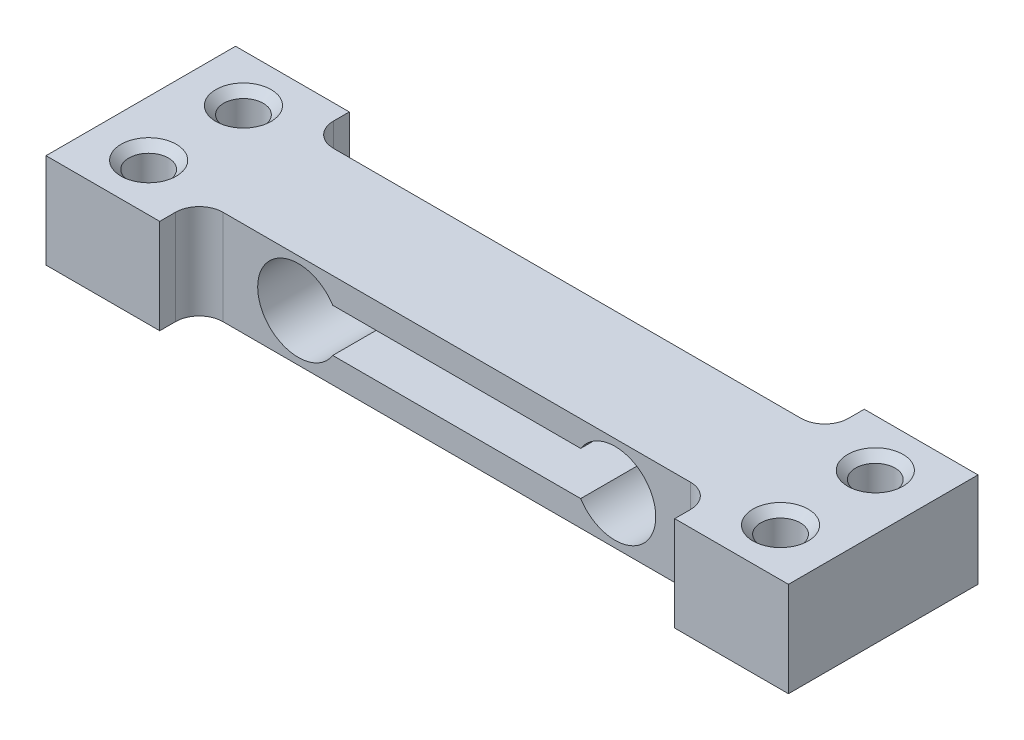
ISO-10303-21;
HEADER;
FILE_DESCRIPTION(('STEP AP214'),'2;1');
FILE_NAME('part.step','',(''),(''),'','','');
FILE_SCHEMA(('AUTOMOTIVE_DESIGN { 1 0 10303 214 1 1 1 1 }'));
ENDSEC;
DATA;
#1=APPLICATION_CONTEXT('core data for automotive mechanical design processes');
#2=APPLICATION_PROTOCOL_DEFINITION('international standard','automotive_design',2000,#1);
#3=PRODUCT_CONTEXT('',#1,'mechanical');
#4=PRODUCT('Part','Part','',(#3));
#5=PRODUCT_RELATED_PRODUCT_CATEGORY('part','',(#4));
#6=PRODUCT_DEFINITION_FORMATION('','',#4);
#7=PRODUCT_DEFINITION_CONTEXT('part definition',#1,'design');
#8=PRODUCT_DEFINITION('design','',#6,#7);
#9=PRODUCT_DEFINITION_SHAPE('','',#8);
#10=(LENGTH_UNIT() NAMED_UNIT(*) SI_UNIT(.MILLI.,.METRE.));
#11=(NAMED_UNIT(*) PLANE_ANGLE_UNIT() SI_UNIT($,.RADIAN.));
#12=(NAMED_UNIT(*) SI_UNIT($,.STERADIAN.) SOLID_ANGLE_UNIT());
#13=UNCERTAINTY_MEASURE_WITH_UNIT(LENGTH_MEASURE(1.E-05),#10,'distance_accuracy_value','');
#14=(GEOMETRIC_REPRESENTATION_CONTEXT(3) GLOBAL_UNCERTAINTY_ASSIGNED_CONTEXT((#13)) GLOBAL_UNIT_ASSIGNED_CONTEXT((#10,
#11,#12)) REPRESENTATION_CONTEXT('',''));
#15=CARTESIAN_POINT('',(0.,0.,0.));
#16=DIRECTION('',(0.,0.,1.));
#17=DIRECTION('',(1.,0.,0.));
#18=AXIS2_PLACEMENT_3D('',#15,#16,#17);
#19=CARTESIAN_POINT('',(0.,3.,-3.5));
#20=DIRECTION('',(0.,0.,1.));
#21=DIRECTION('',(1.,0.,0.));
#22=AXIS2_PLACEMENT_3D('',#19,#20,#21);
#23=PLANE('',#22);
#24=DIRECTION('',(1.,0.,0.));
#25=VECTOR('',#24,1.);
#26=CARTESIAN_POINT('',(0.,1.375,-3.5));
#27=LINE('',#26,#25);
#28=CARTESIAN_POINT('',(-7.84784589429227,1.375,-3.5));
#29=VERTEX_POINT('',#28);
#30=CARTESIAN_POINT('',(7.84784589429227,1.375,-3.5));
#31=VERTEX_POINT('',#30);
#32=EDGE_CURVE('E208',#29,#31,#27,.T.);
#33=ORIENTED_EDGE('',*,*,#32,.F.);
#34=CARTESIAN_POINT('',(-10.025,0.,-3.5));
#35=DIRECTION('',(0.,0.,-1.));
#36=DIRECTION('',(-1.,0.,0.));
#37=AXIS2_PLACEMENT_3D('',#34,#35,#36);
#38=CIRCLE('',#37,2.575);
#39=CARTESIAN_POINT('',(-7.84784589429227,-1.375,-3.5));
#40=VERTEX_POINT('',#39);
#41=EDGE_CURVE('E293',#40,#29,#38,.T.);
#42=ORIENTED_EDGE('',*,*,#41,.F.);
#43=DIRECTION('',(1.,0.,0.));
#44=VECTOR('',#43,1.);
#45=CARTESIAN_POINT('',(0.,-1.375,-3.5));
#46=LINE('',#45,#44);
#47=CARTESIAN_POINT('',(7.84784589429227,-1.375,-3.5));
#48=VERTEX_POINT('',#47);
#49=EDGE_CURVE('E205',#40,#48,#46,.T.);
#50=ORIENTED_EDGE('',*,*,#49,.T.);
#51=CARTESIAN_POINT('',(10.025,0.,-3.5));
#52=DIRECTION('',(0.,0.,1.));
#53=DIRECTION('',(1.,0.,0.));
#54=AXIS2_PLACEMENT_3D('',#51,#52,#53);
#55=CIRCLE('',#54,2.575);
#56=EDGE_CURVE('E148',#48,#31,#55,.T.);
#57=ORIENTED_EDGE('',*,*,#56,.T.);
#58=EDGE_LOOP('',(#33,#42,#50,#57));
#59=FACE_BOUND('',#58,.T.);
#60=DIRECTION('',(-1.,0.,0.));
#61=VECTOR('',#60,1.);
#62=CARTESIAN_POINT('',(0.,-3.,-3.5));
#63=LINE('',#62,#61);
#64=CARTESIAN_POINT('',(14.8,-3.,-3.5));
#65=VERTEX_POINT('',#64);
#66=CARTESIAN_POINT('',(-14.8,-3.,-3.5));
#67=VERTEX_POINT('',#66);
#68=EDGE_CURVE('E144',#65,#67,#63,.T.);
#69=ORIENTED_EDGE('',*,*,#68,.T.);
#70=DIRECTION('',(0.,-1.,0.));
#71=VECTOR('',#70,1.);
#72=CARTESIAN_POINT('',(-14.8,3.,-3.5));
#73=LINE('',#72,#71);
#74=CARTESIAN_POINT('',(-14.8,3.,-3.5));
#75=VERTEX_POINT('',#74);
#76=EDGE_CURVE('E267',#75,#67,#73,.T.);
#77=ORIENTED_EDGE('',*,*,#76,.F.);
#78=DIRECTION('',(-1.,0.,0.));
#79=VECTOR('',#78,1.);
#80=CARTESIAN_POINT('',(0.,3.,-3.5));
#81=LINE('',#80,#79);
#82=CARTESIAN_POINT('',(14.8,3.,-3.5));
#83=VERTEX_POINT('',#82);
#84=EDGE_CURVE('E162',#83,#75,#81,.T.);
#85=ORIENTED_EDGE('',*,*,#84,.F.);
#86=DIRECTION('',(0.,-1.,0.));
#87=VECTOR('',#86,1.);
#88=CARTESIAN_POINT('',(14.8,3.,-3.5));
#89=LINE('',#88,#87);
#90=EDGE_CURVE('E140',#83,#65,#89,.T.);
#91=ORIENTED_EDGE('',*,*,#90,.T.);
#92=EDGE_LOOP('',(#69,#77,#85,#91));
#93=FACE_BOUND('',#92,.T.);
#94=ADVANCED_FACE('F35',(#59,#93),#23,.F.);
#95=CARTESIAN_POINT('',(14.8,3.,3.5));
#96=DIRECTION('',(0.,0.,-1.));
#97=DIRECTION('',(-1.,0.,0.));
#98=AXIS2_PLACEMENT_3D('',#95,#96,#97);
#99=PLANE('',#98);
#100=CARTESIAN_POINT('',(-10.025,0.,3.5));
#101=DIRECTION('',(0.,0.,-1.));
#102=DIRECTION('',(-1.,0.,0.));
#103=AXIS2_PLACEMENT_3D('',#100,#101,#102);
#104=CIRCLE('',#103,2.575);
#105=CARTESIAN_POINT('',(-7.84784589429227,-1.375,3.5));
#106=VERTEX_POINT('',#105);
#107=CARTESIAN_POINT('',(-7.84784589429227,1.375,3.5));
#108=VERTEX_POINT('',#107);
#109=EDGE_CURVE('E319',#106,#108,#104,.T.);
#110=ORIENTED_EDGE('',*,*,#109,.T.);
#111=DIRECTION('',(1.,0.,0.));
#112=VECTOR('',#111,1.);
#113=CARTESIAN_POINT('',(0.,1.375,3.5));
#114=LINE('',#113,#112);
#115=CARTESIAN_POINT('',(7.84784589429227,1.375,3.5));
#116=VERTEX_POINT('',#115);
#117=EDGE_CURVE('E218',#108,#116,#114,.T.);
#118=ORIENTED_EDGE('',*,*,#117,.T.);
#119=CARTESIAN_POINT('',(10.025,0.,3.5));
#120=DIRECTION('',(0.,0.,1.));
#121=DIRECTION('',(1.,0.,0.));
#122=AXIS2_PLACEMENT_3D('',#119,#120,#121);
#123=CIRCLE('',#122,2.575);
#124=CARTESIAN_POINT('',(7.84784589429227,-1.375,3.5));
#125=VERTEX_POINT('',#124);
#126=EDGE_CURVE('E49',#125,#116,#123,.T.);
#127=ORIENTED_EDGE('',*,*,#126,.F.);
#128=DIRECTION('',(1.,0.,0.));
#129=VECTOR('',#128,1.);
#130=CARTESIAN_POINT('',(0.,-1.375,3.5));
#131=LINE('',#130,#129);
#132=EDGE_CURVE('E214',#106,#125,#131,.T.);
#133=ORIENTED_EDGE('',*,*,#132,.F.);
#134=EDGE_LOOP('',(#110,#118,#127,#133));
#135=FACE_BOUND('',#134,.T.);
#136=DIRECTION('',(1.,0.,0.));
#137=VECTOR('',#136,1.);
#138=CARTESIAN_POINT('',(14.8,3.,3.5));
#139=LINE('',#138,#137);
#140=CARTESIAN_POINT('',(-14.8,3.,3.5));
#141=VERTEX_POINT('',#140);
#142=CARTESIAN_POINT('',(14.8,3.,3.5));
#143=VERTEX_POINT('',#142);
#144=EDGE_CURVE('E99',#141,#143,#139,.T.);
#145=ORIENTED_EDGE('',*,*,#144,.F.);
#146=DIRECTION('',(0.,-1.,0.));
#147=VECTOR('',#146,1.);
#148=CARTESIAN_POINT('',(-14.8,3.,3.5));
#149=LINE('',#148,#147);
#150=CARTESIAN_POINT('',(-14.8,-3.,3.5));
#151=VERTEX_POINT('',#150);
#152=EDGE_CURVE('E246',#141,#151,#149,.T.);
#153=ORIENTED_EDGE('',*,*,#152,.T.);
#154=DIRECTION('',(1.,0.,0.));
#155=VECTOR('',#154,1.);
#156=CARTESIAN_POINT('',(14.8,-3.,3.5));
#157=LINE('',#156,#155);
#158=CARTESIAN_POINT('',(14.8,-3.,3.5));
#159=VERTEX_POINT('',#158);
#160=EDGE_CURVE('E147',#151,#159,#157,.T.);
#161=ORIENTED_EDGE('',*,*,#160,.T.);
#162=DIRECTION('',(0.,-1.,0.));
#163=VECTOR('',#162,1.);
#164=CARTESIAN_POINT('',(14.8,3.,3.5));
#165=LINE('',#164,#163);
#166=EDGE_CURVE('E11',#143,#159,#165,.T.);
#167=ORIENTED_EDGE('',*,*,#166,.F.);
#168=EDGE_LOOP('',(#145,#153,#161,#167));
#169=FACE_BOUND('',#168,.T.);
#170=ADVANCED_FACE('F389',(#135,#169),#99,.F.);
#171=CARTESIAN_POINT('',(14.8,3.,4.99999999999999));
#172=DIRECTION('',(0.,-1.,0.));
#173=DIRECTION('',(0.,0.,-1.));
#174=AXIS2_PLACEMENT_3D('',#171,#172,#173);
#175=CYLINDRICAL_SURFACE('',#174,1.5);
#176=CARTESIAN_POINT('',(14.8,-3.,4.99999999999999));
#177=DIRECTION('',(0.,-1.,0.));
#178=DIRECTION('',(0.,0.,1.));
#179=AXIS2_PLACEMENT_3D('',#176,#177,#178);
#180=CIRCLE('',#179,1.5);
#181=CARTESIAN_POINT('',(16.3,-3.,4.99999999999999));
#182=VERTEX_POINT('',#181);
#183=EDGE_CURVE('E150',#159,#182,#180,.T.);
#184=ORIENTED_EDGE('',*,*,#183,.T.);
#185=DIRECTION('',(0.,-1.,0.));
#186=VECTOR('',#185,1.);
#187=CARTESIAN_POINT('',(16.3,3.,4.99999999999999));
#188=LINE('',#187,#186);
#189=CARTESIAN_POINT('',(16.3,3.,4.99999999999999));
#190=VERTEX_POINT('',#189);
#191=EDGE_CURVE('E42',#190,#182,#188,.T.);
#192=ORIENTED_EDGE('',*,*,#191,.F.);
#193=CARTESIAN_POINT('',(14.8,3.,4.99999999999999));
#194=DIRECTION('',(0.,-1.,0.));
#195=DIRECTION('',(0.,0.,1.));
#196=AXIS2_PLACEMENT_3D('',#193,#194,#195);
#197=CIRCLE('',#196,1.5);
#198=EDGE_CURVE('E199',#143,#190,#197,.T.);
#199=ORIENTED_EDGE('',*,*,#198,.F.);
#200=ORIENTED_EDGE('',*,*,#166,.T.);
#201=EDGE_LOOP('',(#184,#192,#199,#200));
#202=FACE_BOUND('',#201,.T.);
#203=ADVANCED_FACE('F394',(#202),#175,.F.);
#204=CARTESIAN_POINT('',(16.3,3.,4.99999999999999));
#205=DIRECTION('',(1.,0.,0.));
#206=DIRECTION('',(0.,0.,-1.));
#207=AXIS2_PLACEMENT_3D('',#204,#205,#206);
#208=PLANE('',#207);
#209=DIRECTION('',(0.,0.,1.));
#210=VECTOR('',#209,1.);
#211=CARTESIAN_POINT('',(16.3,-3.,4.99999999999999));
#212=LINE('',#211,#210);
#213=CARTESIAN_POINT('',(16.3,-3.,6.));
#214=VERTEX_POINT('',#213);
#215=EDGE_CURVE('E152',#182,#214,#212,.T.);
#216=ORIENTED_EDGE('',*,*,#215,.T.);
#217=DIRECTION('',(0.,-1.,0.));
#218=VECTOR('',#217,1.);
#219=CARTESIAN_POINT('',(16.3,3.,6.));
#220=LINE('',#219,#218);
#221=CARTESIAN_POINT('',(16.3,3.,6.));
#222=VERTEX_POINT('',#221);
#223=EDGE_CURVE('E169',#222,#214,#220,.T.);
#224=ORIENTED_EDGE('',*,*,#223,.F.);
#225=DIRECTION('',(0.,0.,1.));
#226=VECTOR('',#225,1.);
#227=CARTESIAN_POINT('',(16.3,3.,4.99999999999999));
#228=LINE('',#227,#226);
#229=EDGE_CURVE('E178',#190,#222,#228,.T.);
#230=ORIENTED_EDGE('',*,*,#229,.F.);
#231=ORIENTED_EDGE('',*,*,#191,.T.);
#232=EDGE_LOOP('',(#216,#224,#230,#231));
#233=FACE_BOUND('',#232,.T.);
#234=ADVANCED_FACE('F176',(#233),#208,.F.);
#235=CARTESIAN_POINT('',(23.5,3.,6.));
#236=DIRECTION('',(0.,0.,-1.));
#237=DIRECTION('',(-1.,0.,0.));
#238=AXIS2_PLACEMENT_3D('',#235,#236,#237);
#239=PLANE('',#238);
#240=DIRECTION('',(1.,0.,0.));
#241=VECTOR('',#240,1.);
#242=CARTESIAN_POINT('',(23.5,-3.,6.));
#243=LINE('',#242,#241);
#244=CARTESIAN_POINT('',(23.5,-3.,6.));
#245=VERTEX_POINT('',#244);
#246=EDGE_CURVE('E154',#214,#245,#243,.T.);
#247=ORIENTED_EDGE('',*,*,#246,.T.);
#248=DIRECTION('',(0.,-1.,0.));
#249=VECTOR('',#248,1.);
#250=CARTESIAN_POINT('',(23.5,3.,6.));
#251=LINE('',#250,#249);
#252=CARTESIAN_POINT('',(23.5,3.,6.));
#253=VERTEX_POINT('',#252);
#254=EDGE_CURVE('E166',#253,#245,#251,.T.);
#255=ORIENTED_EDGE('',*,*,#254,.F.);
#256=DIRECTION('',(1.,0.,0.));
#257=VECTOR('',#256,1.);
#258=CARTESIAN_POINT('',(23.5,3.,6.));
#259=LINE('',#258,#257);
#260=EDGE_CURVE('E195',#222,#253,#259,.T.);
#261=ORIENTED_EDGE('',*,*,#260,.F.);
#262=ORIENTED_EDGE('',*,*,#223,.T.);
#263=EDGE_LOOP('',(#247,#255,#261,#262));
#264=FACE_BOUND('',#263,.T.);
#265=ADVANCED_FACE('F191',(#264),#239,.F.);
#266=CARTESIAN_POINT('',(23.5,3.,-6.));
#267=DIRECTION('',(-1.,0.,0.));
#268=DIRECTION('',(0.,0.,1.));
#269=AXIS2_PLACEMENT_3D('',#266,#267,#268);
#270=PLANE('',#269);
#271=DIRECTION('',(0.,0.,-1.));
#272=VECTOR('',#271,1.);
#273=CARTESIAN_POINT('',(23.5,-3.,-6.));
#274=LINE('',#273,#272);
#275=CARTESIAN_POINT('',(23.5,-3.,-6.));
#276=VERTEX_POINT('',#275);
#277=EDGE_CURVE('E156',#245,#276,#274,.T.);
#278=ORIENTED_EDGE('',*,*,#277,.T.);
#279=DIRECTION('',(0.,-1.,0.));
#280=VECTOR('',#279,1.);
#281=CARTESIAN_POINT('',(23.5,3.,-6.));
#282=LINE('',#281,#280);
#283=CARTESIAN_POINT('',(23.5,3.,-6.));
#284=VERTEX_POINT('',#283);
#285=EDGE_CURVE('E135',#284,#276,#282,.T.);
#286=ORIENTED_EDGE('',*,*,#285,.F.);
#287=DIRECTION('',(0.,0.,-1.));
#288=VECTOR('',#287,1.);
#289=CARTESIAN_POINT('',(23.5,3.,-6.));
#290=LINE('',#289,#288);
#291=EDGE_CURVE('E123',#253,#284,#290,.T.);
#292=ORIENTED_EDGE('',*,*,#291,.F.);
#293=ORIENTED_EDGE('',*,*,#254,.T.);
#294=EDGE_LOOP('',(#278,#286,#292,#293));
#295=FACE_BOUND('',#294,.T.);
#296=ADVANCED_FACE('F194',(#295),#270,.F.);
#297=CARTESIAN_POINT('',(16.3,3.,-6.));
#298=DIRECTION('',(0.,0.,1.));
#299=DIRECTION('',(1.,0.,0.));
#300=AXIS2_PLACEMENT_3D('',#297,#298,#299);
#301=PLANE('',#300);
#302=DIRECTION('',(-1.,0.,0.));
#303=VECTOR('',#302,1.);
#304=CARTESIAN_POINT('',(16.3,-3.,-6.));
#305=LINE('',#304,#303);
#306=CARTESIAN_POINT('',(16.3,-3.,-6.));
#307=VERTEX_POINT('',#306);
#308=EDGE_CURVE('E132',#276,#307,#305,.T.);
#309=ORIENTED_EDGE('',*,*,#308,.T.);
#310=DIRECTION('',(0.,-1.,0.));
#311=VECTOR('',#310,1.);
#312=CARTESIAN_POINT('',(16.3,3.,-6.));
#313=LINE('',#312,#311);
#314=CARTESIAN_POINT('',(16.3,3.,-6.));
#315=VERTEX_POINT('',#314);
#316=EDGE_CURVE('E129',#315,#307,#313,.T.);
#317=ORIENTED_EDGE('',*,*,#316,.F.);
#318=DIRECTION('',(-1.,0.,0.));
#319=VECTOR('',#318,1.);
#320=CARTESIAN_POINT('',(16.3,3.,-6.));
#321=LINE('',#320,#319);
#322=EDGE_CURVE('E115',#284,#315,#321,.T.);
#323=ORIENTED_EDGE('',*,*,#322,.F.);
#324=ORIENTED_EDGE('',*,*,#285,.T.);
#325=EDGE_LOOP('',(#309,#317,#323,#324));
#326=FACE_BOUND('',#325,.T.);
#327=ADVANCED_FACE('F130',(#326),#301,.F.);
#328=CARTESIAN_POINT('',(16.3,3.,-5.));
#329=DIRECTION('',(1.,0.,0.));
#330=DIRECTION('',(0.,0.,-1.));
#331=AXIS2_PLACEMENT_3D('',#328,#329,#330);
#332=PLANE('',#331);
#333=DIRECTION('',(0.,0.,1.));
#334=VECTOR('',#333,1.);
#335=CARTESIAN_POINT('',(16.3,-3.,-5.));
#336=LINE('',#335,#334);
#337=CARTESIAN_POINT('',(16.3,-3.,-5.));
#338=VERTEX_POINT('',#337);
#339=EDGE_CURVE('E159',#307,#338,#336,.T.);
#340=ORIENTED_EDGE('',*,*,#339,.T.);
#341=DIRECTION('',(0.,-1.,0.));
#342=VECTOR('',#341,1.);
#343=CARTESIAN_POINT('',(16.3,3.,-5.));
#344=LINE('',#343,#342);
#345=CARTESIAN_POINT('',(16.3,3.,-5.));
#346=VERTEX_POINT('',#345);
#347=EDGE_CURVE('E136',#346,#338,#344,.T.);
#348=ORIENTED_EDGE('',*,*,#347,.F.);
#349=DIRECTION('',(0.,0.,1.));
#350=VECTOR('',#349,1.);
#351=CARTESIAN_POINT('',(16.3,3.,-5.));
#352=LINE('',#351,#350);
#353=EDGE_CURVE('E120',#315,#346,#352,.T.);
#354=ORIENTED_EDGE('',*,*,#353,.F.);
#355=ORIENTED_EDGE('',*,*,#316,.T.);
#356=EDGE_LOOP('',(#340,#348,#354,#355));
#357=FACE_BOUND('',#356,.T.);
#358=ADVANCED_FACE('F138',(#357),#332,.F.);
#359=CARTESIAN_POINT('',(14.8,3.,-5.));
#360=DIRECTION('',(0.,-1.,0.));
#361=DIRECTION('',(0.,0.,-1.));
#362=AXIS2_PLACEMENT_3D('',#359,#360,#361);
#363=CYLINDRICAL_SURFACE('',#362,1.5);
#364=CARTESIAN_POINT('',(14.8,-3.,-5.));
#365=DIRECTION('',(0.,-1.,0.));
#366=DIRECTION('',(0.,0.,1.));
#367=AXIS2_PLACEMENT_3D('',#364,#365,#366);
#368=CIRCLE('',#367,1.5);
#369=EDGE_CURVE('E91',#338,#65,#368,.T.);
#370=ORIENTED_EDGE('',*,*,#369,.T.);
#371=ORIENTED_EDGE('',*,*,#90,.F.);
#372=CARTESIAN_POINT('',(14.8,3.,-5.));
#373=DIRECTION('',(0.,-1.,0.));
#374=DIRECTION('',(0.,0.,1.));
#375=AXIS2_PLACEMENT_3D('',#372,#373,#374);
#376=CIRCLE('',#375,1.5);
#377=EDGE_CURVE('E58',#346,#83,#376,.T.);
#378=ORIENTED_EDGE('',*,*,#377,.F.);
#379=ORIENTED_EDGE('',*,*,#347,.T.);
#380=EDGE_LOOP('',(#370,#371,#378,#379));
#381=FACE_BOUND('',#380,.T.);
#382=ADVANCED_FACE('F378',(#381),#363,.F.);
#383=CARTESIAN_POINT('',(14.8,3.,-5.));
#384=DIRECTION('',(0.,1.,0.));
#385=DIRECTION('',(0.,0.,1.));
#386=AXIS2_PLACEMENT_3D('',#383,#384,#385);
#387=PLANE('',#386);
#388=CARTESIAN_POINT('',(20.,3.,-3.));
#389=DIRECTION('',(0.,1.,0.));
#390=DIRECTION('',(0.,0.,1.));
#391=AXIS2_PLACEMENT_3D('',#388,#389,#390);
#392=CIRCLE('',#391,1.75);
#393=CARTESIAN_POINT('',(20.,3.,-1.25));
#394=VERTEX_POINT('',#393);
#395=EDGE_CURVE('E240',#394,#394,#392,.T.);
#396=ORIENTED_EDGE('',*,*,#395,.F.);
#397=EDGE_LOOP('',(#396));
#398=FACE_BOUND('',#397,.T.);
#399=CARTESIAN_POINT('',(20.,3.,3.));
#400=DIRECTION('',(0.,1.,0.));
#401=DIRECTION('',(0.,0.,1.));
#402=AXIS2_PLACEMENT_3D('',#399,#400,#401);
#403=CIRCLE('',#402,1.75);
#404=CARTESIAN_POINT('',(20.,3.,4.75));
#405=VERTEX_POINT('',#404);
#406=EDGE_CURVE('E228',#405,#405,#403,.T.);
#407=ORIENTED_EDGE('',*,*,#406,.F.);
#408=EDGE_LOOP('',(#407));
#409=FACE_BOUND('',#408,.T.);
#410=ORIENTED_EDGE('',*,*,#84,.T.);
#411=CARTESIAN_POINT('',(-14.8,3.,-5.));
#412=DIRECTION('',(0.,1.,0.));
#413=DIRECTION('',(0.,0.,1.));
#414=AXIS2_PLACEMENT_3D('',#411,#412,#413);
#415=CIRCLE('',#414,1.5);
#416=CARTESIAN_POINT('',(-16.3,3.,-5.));
#417=VERTEX_POINT('',#416);
#418=EDGE_CURVE('E270',#417,#75,#415,.T.);
#419=ORIENTED_EDGE('',*,*,#418,.F.);
#420=DIRECTION('',(0.,0.,1.));
#421=VECTOR('',#420,1.);
#422=CARTESIAN_POINT('',(-16.3,3.,-5.));
#423=LINE('',#422,#421);
#424=CARTESIAN_POINT('',(-16.3,3.,-6.));
#425=VERTEX_POINT('',#424);
#426=EDGE_CURVE('E296',#425,#417,#423,.T.);
#427=ORIENTED_EDGE('',*,*,#426,.F.);
#428=DIRECTION('',(1.,0.,0.));
#429=VECTOR('',#428,1.);
#430=CARTESIAN_POINT('',(-16.3,3.,-6.));
#431=LINE('',#430,#429);
#432=CARTESIAN_POINT('',(-23.5,3.,-6.));
#433=VERTEX_POINT('',#432);
#434=EDGE_CURVE('E299',#433,#425,#431,.T.);
#435=ORIENTED_EDGE('',*,*,#434,.F.);
#436=DIRECTION('',(0.,0.,-1.));
#437=VECTOR('',#436,1.);
#438=CARTESIAN_POINT('',(-23.5,3.,-6.));
#439=LINE('',#438,#437);
#440=CARTESIAN_POINT('',(-23.5,3.,6.));
#441=VERTEX_POINT('',#440);
#442=EDGE_CURVE('E302',#441,#433,#439,.T.);
#443=ORIENTED_EDGE('',*,*,#442,.F.);
#444=DIRECTION('',(-1.,0.,0.));
#445=VECTOR('',#444,1.);
#446=CARTESIAN_POINT('',(-23.5,3.,6.));
#447=LINE('',#446,#445);
#448=CARTESIAN_POINT('',(-16.3,3.,6.));
#449=VERTEX_POINT('',#448);
#450=EDGE_CURVE('E305',#449,#441,#447,.T.);
#451=ORIENTED_EDGE('',*,*,#450,.F.);
#452=DIRECTION('',(0.,0.,1.));
#453=VECTOR('',#452,1.);
#454=CARTESIAN_POINT('',(-16.3,3.,4.99999999999999));
#455=LINE('',#454,#453);
#456=CARTESIAN_POINT('',(-16.3,3.,4.99999999999999));
#457=VERTEX_POINT('',#456);
#458=EDGE_CURVE('E308',#457,#449,#455,.T.);
#459=ORIENTED_EDGE('',*,*,#458,.F.);
#460=CARTESIAN_POINT('',(-14.8,3.,4.99999999999999));
#461=DIRECTION('',(0.,1.,0.));
#462=DIRECTION('',(0.,0.,1.));
#463=AXIS2_PLACEMENT_3D('',#460,#461,#462);
#464=CIRCLE('',#463,1.5);
#465=EDGE_CURVE('E274',#141,#457,#464,.T.);
#466=ORIENTED_EDGE('',*,*,#465,.F.);
#467=ORIENTED_EDGE('',*,*,#144,.T.);
#468=ORIENTED_EDGE('',*,*,#198,.T.);
#469=ORIENTED_EDGE('',*,*,#229,.T.);
#470=ORIENTED_EDGE('',*,*,#260,.T.);
#471=ORIENTED_EDGE('',*,*,#291,.T.);
#472=ORIENTED_EDGE('',*,*,#322,.T.);
#473=ORIENTED_EDGE('',*,*,#353,.T.);
#474=ORIENTED_EDGE('',*,*,#377,.T.);
#475=EDGE_LOOP('',(#410,#419,#427,#435,#443,#451,#459,#466,#467,#468,#469,#470,#471,#472,#473,#474));
#476=FACE_BOUND('',#475,.T.);
#477=CARTESIAN_POINT('',(-20.,3.,-3.));
#478=DIRECTION('',(0.,-1.,0.));
#479=DIRECTION('',(0.,0.,1.));
#480=AXIS2_PLACEMENT_3D('',#477,#478,#479);
#481=CIRCLE('',#480,1.75);
#482=CARTESIAN_POINT('',(-20.,3.,-1.25));
#483=VERTEX_POINT('',#482);
#484=EDGE_CURVE('E342',#483,#483,#481,.T.);
#485=ORIENTED_EDGE('',*,*,#484,.T.);
#486=EDGE_LOOP('',(#485));
#487=FACE_BOUND('',#486,.T.);
#488=CARTESIAN_POINT('',(-20.,3.,3.));
#489=DIRECTION('',(0.,-1.,0.));
#490=DIRECTION('',(0.,0.,1.));
#491=AXIS2_PLACEMENT_3D('',#488,#489,#490);
#492=CIRCLE('',#491,1.75);
#493=CARTESIAN_POINT('',(-20.,3.,4.75));
#494=VERTEX_POINT('',#493);
#495=EDGE_CURVE('E330',#494,#494,#492,.T.);
#496=ORIENTED_EDGE('',*,*,#495,.T.);
#497=EDGE_LOOP('',(#496));
#498=FACE_BOUND('',#497,.T.);
#499=ADVANCED_FACE('F117',(#398,#409,#476,#487,#498),#387,.T.);
#500=CARTESIAN_POINT('',(14.8,-3.,-5.));
#501=DIRECTION('',(0.,1.,0.));
#502=DIRECTION('',(0.,0.,1.));
#503=AXIS2_PLACEMENT_3D('',#500,#501,#502);
#504=PLANE('',#503);
#505=CARTESIAN_POINT('',(20.,-3.,-3.));
#506=DIRECTION('',(0.,1.,0.));
#507=DIRECTION('',(0.,0.,1.));
#508=AXIS2_PLACEMENT_3D('',#505,#506,#507);
#509=CIRCLE('',#508,1.75);
#510=CARTESIAN_POINT('',(20.,-3.,-1.25));
#511=VERTEX_POINT('',#510);
#512=EDGE_CURVE('E243',#511,#511,#509,.T.);
#513=ORIENTED_EDGE('',*,*,#512,.T.);
#514=EDGE_LOOP('',(#513));
#515=FACE_BOUND('',#514,.T.);
#516=CARTESIAN_POINT('',(20.,-3.,3.));
#517=DIRECTION('',(0.,1.,0.));
#518=DIRECTION('',(0.,0.,1.));
#519=AXIS2_PLACEMENT_3D('',#516,#517,#518);
#520=CIRCLE('',#519,1.75);
#521=CARTESIAN_POINT('',(20.,-3.,4.75));
#522=VERTEX_POINT('',#521);
#523=EDGE_CURVE('E231',#522,#522,#520,.T.);
#524=ORIENTED_EDGE('',*,*,#523,.T.);
#525=EDGE_LOOP('',(#524));
#526=FACE_BOUND('',#525,.T.);
#527=ORIENTED_EDGE('',*,*,#68,.F.);
#528=ORIENTED_EDGE('',*,*,#369,.F.);
#529=ORIENTED_EDGE('',*,*,#339,.F.);
#530=ORIENTED_EDGE('',*,*,#308,.F.);
#531=ORIENTED_EDGE('',*,*,#277,.F.);
#532=ORIENTED_EDGE('',*,*,#246,.F.);
#533=ORIENTED_EDGE('',*,*,#215,.F.);
#534=ORIENTED_EDGE('',*,*,#183,.F.);
#535=ORIENTED_EDGE('',*,*,#160,.F.);
#536=CARTESIAN_POINT('',(-14.8,-3.,4.99999999999999));
#537=DIRECTION('',(0.,1.,0.));
#538=DIRECTION('',(0.,0.,1.));
#539=AXIS2_PLACEMENT_3D('',#536,#537,#538);
#540=CIRCLE('',#539,1.5);
#541=CARTESIAN_POINT('',(-16.3,-3.,4.99999999999999));
#542=VERTEX_POINT('',#541);
#543=EDGE_CURVE('E290',#151,#542,#540,.T.);
#544=ORIENTED_EDGE('',*,*,#543,.T.);
#545=DIRECTION('',(0.,0.,1.));
#546=VECTOR('',#545,1.);
#547=CARTESIAN_POINT('',(-16.3,-3.,4.99999999999999));
#548=LINE('',#547,#546);
#549=CARTESIAN_POINT('',(-16.3,-3.,6.));
#550=VERTEX_POINT('',#549);
#551=EDGE_CURVE('E287',#542,#550,#548,.T.);
#552=ORIENTED_EDGE('',*,*,#551,.T.);
#553=DIRECTION('',(-1.,0.,0.));
#554=VECTOR('',#553,1.);
#555=CARTESIAN_POINT('',(-23.5,-3.,6.));
#556=LINE('',#555,#554);
#557=CARTESIAN_POINT('',(-23.5,-3.,6.));
#558=VERTEX_POINT('',#557);
#559=EDGE_CURVE('E284',#550,#558,#556,.T.);
#560=ORIENTED_EDGE('',*,*,#559,.T.);
#561=DIRECTION('',(0.,0.,-1.));
#562=VECTOR('',#561,1.);
#563=CARTESIAN_POINT('',(-23.5,-3.,-6.));
#564=LINE('',#563,#562);
#565=CARTESIAN_POINT('',(-23.5,-3.,-6.));
#566=VERTEX_POINT('',#565);
#567=EDGE_CURVE('E281',#558,#566,#564,.T.);
#568=ORIENTED_EDGE('',*,*,#567,.T.);
#569=DIRECTION('',(1.,0.,0.));
#570=VECTOR('',#569,1.);
#571=CARTESIAN_POINT('',(-16.3,-3.,-6.));
#572=LINE('',#571,#570);
#573=CARTESIAN_POINT('',(-16.3,-3.,-6.));
#574=VERTEX_POINT('',#573);
#575=EDGE_CURVE('E278',#566,#574,#572,.T.);
#576=ORIENTED_EDGE('',*,*,#575,.T.);
#577=DIRECTION('',(0.,0.,1.));
#578=VECTOR('',#577,1.);
#579=CARTESIAN_POINT('',(-16.3,-3.,-5.));
#580=LINE('',#579,#578);
#581=CARTESIAN_POINT('',(-16.3,-3.,-5.));
#582=VERTEX_POINT('',#581);
#583=EDGE_CURVE('E275',#574,#582,#580,.T.);
#584=ORIENTED_EDGE('',*,*,#583,.T.);
#585=CARTESIAN_POINT('',(-14.8,-3.,-5.));
#586=DIRECTION('',(0.,1.,0.));
#587=DIRECTION('',(0.,0.,1.));
#588=AXIS2_PLACEMENT_3D('',#585,#586,#587);
#589=CIRCLE('',#588,1.5);
#590=EDGE_CURVE('E271',#582,#67,#589,.T.);
#591=ORIENTED_EDGE('',*,*,#590,.T.);
#592=EDGE_LOOP('',(#527,#528,#529,#530,#531,#532,#533,#534,#535,#544,#552,#560,#568,#576,#584,#591));
#593=FACE_BOUND('',#592,.T.);
#594=CARTESIAN_POINT('',(-20.,-3.,-3.));
#595=DIRECTION('',(0.,-1.,0.));
#596=DIRECTION('',(0.,0.,1.));
#597=AXIS2_PLACEMENT_3D('',#594,#595,#596);
#598=CIRCLE('',#597,1.75);
#599=CARTESIAN_POINT('',(-20.,-3.,-1.25));
#600=VERTEX_POINT('',#599);
#601=EDGE_CURVE('E345',#600,#600,#598,.T.);
#602=ORIENTED_EDGE('',*,*,#601,.F.);
#603=EDGE_LOOP('',(#602));
#604=FACE_BOUND('',#603,.T.);
#605=CARTESIAN_POINT('',(-20.,-3.,3.));
#606=DIRECTION('',(0.,-1.,0.));
#607=DIRECTION('',(0.,0.,1.));
#608=AXIS2_PLACEMENT_3D('',#605,#606,#607);
#609=CIRCLE('',#608,1.75);
#610=CARTESIAN_POINT('',(-20.,-3.,4.75));
#611=VERTEX_POINT('',#610);
#612=EDGE_CURVE('E333',#611,#611,#609,.T.);
#613=ORIENTED_EDGE('',*,*,#612,.F.);
#614=EDGE_LOOP('',(#613));
#615=FACE_BOUND('',#614,.T.);
#616=ADVANCED_FACE('F185',(#515,#526,#593,#604,#615),#504,.F.);
#617=CARTESIAN_POINT('',(10.025,0.,-6.));
#618=DIRECTION('',(0.,0.,1.));
#619=DIRECTION('',(1.,0.,0.));
#620=AXIS2_PLACEMENT_3D('',#617,#618,#619);
#621=CYLINDRICAL_SURFACE('',#620,2.575);
#622=DIRECTION('',(0.,0.,1.));
#623=VECTOR('',#622,1.);
#624=CARTESIAN_POINT('',(7.84784589429227,-1.375,-6.));
#625=LINE('',#624,#623);
#626=EDGE_CURVE('E211',#48,#125,#625,.T.);
#627=ORIENTED_EDGE('',*,*,#626,.T.);
#628=ORIENTED_EDGE('',*,*,#126,.T.);
#629=DIRECTION('',(0.,0.,1.));
#630=VECTOR('',#629,1.);
#631=CARTESIAN_POINT('',(7.84784589429227,1.375,-6.));
#632=LINE('',#631,#630);
#633=EDGE_CURVE('E212',#31,#116,#632,.T.);
#634=ORIENTED_EDGE('',*,*,#633,.F.);
#635=ORIENTED_EDGE('',*,*,#56,.F.);
#636=EDGE_LOOP('',(#627,#628,#634,#635));
#637=FACE_BOUND('',#636,.T.);
#638=ADVANCED_FACE('F353',(#637),#621,.F.);
#639=CARTESIAN_POINT('',(0.,-1.375,-6.));
#640=DIRECTION('',(0.,-1.,0.));
#641=DIRECTION('',(0.,0.,-1.));
#642=AXIS2_PLACEMENT_3D('',#639,#640,#641);
#643=PLANE('',#642);
#644=ORIENTED_EDGE('',*,*,#49,.F.);
#645=DIRECTION('',(0.,0.,1.));
#646=VECTOR('',#645,1.);
#647=CARTESIAN_POINT('',(-7.84784589429227,-1.375,-6.));
#648=LINE('',#647,#646);
#649=EDGE_CURVE('E315',#40,#106,#648,.T.);
#650=ORIENTED_EDGE('',*,*,#649,.T.);
#651=ORIENTED_EDGE('',*,*,#132,.T.);
#652=ORIENTED_EDGE('',*,*,#626,.F.);
#653=EDGE_LOOP('',(#644,#650,#651,#652));
#654=FACE_BOUND('',#653,.T.);
#655=ADVANCED_FACE('F453',(#654),#643,.F.);
#656=CARTESIAN_POINT('',(0.,1.375,-6.));
#657=DIRECTION('',(0.,-1.,0.));
#658=DIRECTION('',(0.,0.,-1.));
#659=AXIS2_PLACEMENT_3D('',#656,#657,#658);
#660=PLANE('',#659);
#661=ORIENTED_EDGE('',*,*,#32,.T.);
#662=ORIENTED_EDGE('',*,*,#633,.T.);
#663=ORIENTED_EDGE('',*,*,#117,.F.);
#664=DIRECTION('',(0.,0.,1.));
#665=VECTOR('',#664,1.);
#666=CARTESIAN_POINT('',(-7.84784589429227,1.375,-6.));
#667=LINE('',#666,#665);
#668=EDGE_CURVE('E316',#29,#108,#667,.T.);
#669=ORIENTED_EDGE('',*,*,#668,.F.);
#670=EDGE_LOOP('',(#661,#662,#663,#669));
#671=FACE_BOUND('',#670,.T.);
#672=ADVANCED_FACE('F535',(#671),#660,.T.);
#673=CARTESIAN_POINT('',(20.,-2.5,3.));
#674=DIRECTION('',(0.,-1.,0.));
#675=DIRECTION('',(0.,0.,-1.));
#676=AXIS2_PLACEMENT_3D('',#673,#674,#675);
#677=CONICAL_SURFACE('',#676,1.25,0.785398163397448);
#678=ORIENTED_EDGE('',*,*,#523,.F.);
#679=EDGE_LOOP('',(#678));
#680=FACE_BOUND('',#679,.T.);
#681=CARTESIAN_POINT('',(20.,-2.5,3.));
#682=DIRECTION('',(0.,1.,0.));
#683=DIRECTION('',(0.,0.,1.));
#684=AXIS2_PLACEMENT_3D('',#681,#682,#683);
#685=CIRCLE('',#684,1.25);
#686=CARTESIAN_POINT('',(20.,-2.5,4.25));
#687=VERTEX_POINT('',#686);
#688=EDGE_CURVE('E222',#687,#687,#685,.T.);
#689=ORIENTED_EDGE('',*,*,#688,.T.);
#690=EDGE_LOOP('',(#689));
#691=FACE_BOUND('',#690,.T.);
#692=ADVANCED_FACE('F541',(#680,#691),#677,.F.);
#693=CARTESIAN_POINT('',(20.,3.,3.));
#694=DIRECTION('',(0.,1.,0.));
#695=DIRECTION('',(0.,0.,1.));
#696=AXIS2_PLACEMENT_3D('',#693,#694,#695);
#697=CYLINDRICAL_SURFACE('',#696,1.25);
#698=ORIENTED_EDGE('',*,*,#688,.F.);
#699=EDGE_LOOP('',(#698));
#700=FACE_BOUND('',#699,.T.);
#701=CARTESIAN_POINT('',(20.,2.5,3.));
#702=DIRECTION('',(0.,1.,0.));
#703=DIRECTION('',(0.,0.,1.));
#704=AXIS2_PLACEMENT_3D('',#701,#702,#703);
#705=CIRCLE('',#704,1.25);
#706=CARTESIAN_POINT('',(20.,2.5,4.25));
#707=VERTEX_POINT('',#706);
#708=EDGE_CURVE('E225',#707,#707,#705,.T.);
#709=ORIENTED_EDGE('',*,*,#708,.T.);
#710=EDGE_LOOP('',(#709));
#711=FACE_BOUND('',#710,.T.);
#712=ADVANCED_FACE('F558',(#700,#711),#697,.F.);
#713=CARTESIAN_POINT('',(20.,3.,3.));
#714=DIRECTION('',(0.,1.,0.));
#715=DIRECTION('',(0.,0.,1.));
#716=AXIS2_PLACEMENT_3D('',#713,#714,#715);
#717=CONICAL_SURFACE('',#716,1.75,0.785398163397447);
#718=ORIENTED_EDGE('',*,*,#708,.F.);
#719=EDGE_LOOP('',(#718));
#720=FACE_BOUND('',#719,.T.);
#721=ORIENTED_EDGE('',*,*,#406,.T.);
#722=EDGE_LOOP('',(#721));
#723=FACE_BOUND('',#722,.T.);
#724=ADVANCED_FACE('F721',(#720,#723),#717,.F.);
#725=CARTESIAN_POINT('',(20.,-2.5,-3.));
#726=DIRECTION('',(0.,-1.,0.));
#727=DIRECTION('',(0.,0.,-1.));
#728=AXIS2_PLACEMENT_3D('',#725,#726,#727);
#729=CONICAL_SURFACE('',#728,1.25,0.785398163397448);
#730=ORIENTED_EDGE('',*,*,#512,.F.);
#731=EDGE_LOOP('',(#730));
#732=FACE_BOUND('',#731,.T.);
#733=CARTESIAN_POINT('',(20.,-2.5,-3.));
#734=DIRECTION('',(0.,1.,0.));
#735=DIRECTION('',(0.,0.,1.));
#736=AXIS2_PLACEMENT_3D('',#733,#734,#735);
#737=CIRCLE('',#736,1.25);
#738=CARTESIAN_POINT('',(20.,-2.5,-1.75));
#739=VERTEX_POINT('',#738);
#740=EDGE_CURVE('E234',#739,#739,#737,.T.);
#741=ORIENTED_EDGE('',*,*,#740,.T.);
#742=EDGE_LOOP('',(#741));
#743=FACE_BOUND('',#742,.T.);
#744=ADVANCED_FACE('F717',(#732,#743),#729,.F.);
#745=CARTESIAN_POINT('',(20.,3.,-3.));
#746=DIRECTION('',(0.,1.,0.));
#747=DIRECTION('',(0.,0.,1.));
#748=AXIS2_PLACEMENT_3D('',#745,#746,#747);
#749=CYLINDRICAL_SURFACE('',#748,1.25);
#750=ORIENTED_EDGE('',*,*,#740,.F.);
#751=EDGE_LOOP('',(#750));
#752=FACE_BOUND('',#751,.T.);
#753=CARTESIAN_POINT('',(20.,2.5,-3.));
#754=DIRECTION('',(0.,1.,0.));
#755=DIRECTION('',(0.,0.,1.));
#756=AXIS2_PLACEMENT_3D('',#753,#754,#755);
#757=CIRCLE('',#756,1.25);
#758=CARTESIAN_POINT('',(20.,2.5,-1.75));
#759=VERTEX_POINT('',#758);
#760=EDGE_CURVE('E237',#759,#759,#757,.T.);
#761=ORIENTED_EDGE('',*,*,#760,.T.);
#762=EDGE_LOOP('',(#761));
#763=FACE_BOUND('',#762,.T.);
#764=ADVANCED_FACE('F713',(#752,#763),#749,.F.);
#765=CARTESIAN_POINT('',(20.,3.,-3.));
#766=DIRECTION('',(0.,1.,0.));
#767=DIRECTION('',(0.,0.,1.));
#768=AXIS2_PLACEMENT_3D('',#765,#766,#767);
#769=CONICAL_SURFACE('',#768,1.75,0.785398163397443);
#770=ORIENTED_EDGE('',*,*,#760,.F.);
#771=EDGE_LOOP('',(#770));
#772=FACE_BOUND('',#771,.T.);
#773=ORIENTED_EDGE('',*,*,#395,.T.);
#774=EDGE_LOOP('',(#773));
#775=FACE_BOUND('',#774,.T.);
#776=ADVANCED_FACE('F597',(#772,#775),#769,.F.);
#777=CARTESIAN_POINT('',(-14.8,3.,4.99999999999999));
#778=DIRECTION('',(0.,-1.,0.));
#779=DIRECTION('',(0.,0.,-1.));
#780=AXIS2_PLACEMENT_3D('',#777,#778,#779);
#781=CYLINDRICAL_SURFACE('',#780,1.5);
#782=ORIENTED_EDGE('',*,*,#543,.F.);
#783=ORIENTED_EDGE('',*,*,#152,.F.);
#784=ORIENTED_EDGE('',*,*,#465,.T.);
#785=DIRECTION('',(0.,-1.,0.));
#786=VECTOR('',#785,1.);
#787=CARTESIAN_POINT('',(-16.3,3.,4.99999999999999));
#788=LINE('',#787,#786);
#789=EDGE_CURVE('E249',#457,#542,#788,.T.);
#790=ORIENTED_EDGE('',*,*,#789,.T.);
#791=EDGE_LOOP('',(#782,#783,#784,#790));
#792=FACE_BOUND('',#791,.T.);
#793=ADVANCED_FACE('F487',(#792),#781,.F.);
#794=CARTESIAN_POINT('',(-16.3,3.,4.99999999999999));
#795=DIRECTION('',(-1.,0.,0.));
#796=DIRECTION('',(0.,0.,-1.));
#797=AXIS2_PLACEMENT_3D('',#794,#795,#796);
#798=PLANE('',#797);
#799=ORIENTED_EDGE('',*,*,#551,.F.);
#800=ORIENTED_EDGE('',*,*,#789,.F.);
#801=ORIENTED_EDGE('',*,*,#458,.T.);
#802=DIRECTION('',(0.,-1.,0.));
#803=VECTOR('',#802,1.);
#804=CARTESIAN_POINT('',(-16.3,3.,6.));
#805=LINE('',#804,#803);
#806=EDGE_CURVE('E252',#449,#550,#805,.T.);
#807=ORIENTED_EDGE('',*,*,#806,.T.);
#808=EDGE_LOOP('',(#799,#800,#801,#807));
#809=FACE_BOUND('',#808,.T.);
#810=ADVANCED_FACE('F484',(#809),#798,.F.);
#811=CARTESIAN_POINT('',(-23.5,3.,6.));
#812=DIRECTION('',(0.,0.,-1.));
#813=DIRECTION('',(1.,0.,0.));
#814=AXIS2_PLACEMENT_3D('',#811,#812,#813);
#815=PLANE('',#814);
#816=ORIENTED_EDGE('',*,*,#559,.F.);
#817=ORIENTED_EDGE('',*,*,#806,.F.);
#818=ORIENTED_EDGE('',*,*,#450,.T.);
#819=DIRECTION('',(0.,-1.,0.));
#820=VECTOR('',#819,1.);
#821=CARTESIAN_POINT('',(-23.5,3.,6.));
#822=LINE('',#821,#820);
#823=EDGE_CURVE('E255',#441,#558,#822,.T.);
#824=ORIENTED_EDGE('',*,*,#823,.T.);
#825=EDGE_LOOP('',(#816,#817,#818,#824));
#826=FACE_BOUND('',#825,.T.);
#827=ADVANCED_FACE('F480',(#826),#815,.F.);
#828=CARTESIAN_POINT('',(-23.5,3.,-6.));
#829=DIRECTION('',(1.,0.,0.));
#830=DIRECTION('',(0.,0.,1.));
#831=AXIS2_PLACEMENT_3D('',#828,#829,#830);
#832=PLANE('',#831);
#833=ORIENTED_EDGE('',*,*,#567,.F.);
#834=ORIENTED_EDGE('',*,*,#823,.F.);
#835=ORIENTED_EDGE('',*,*,#442,.T.);
#836=DIRECTION('',(0.,-1.,0.));
#837=VECTOR('',#836,1.);
#838=CARTESIAN_POINT('',(-23.5,3.,-6.));
#839=LINE('',#838,#837);
#840=EDGE_CURVE('E258',#433,#566,#839,.T.);
#841=ORIENTED_EDGE('',*,*,#840,.T.);
#842=EDGE_LOOP('',(#833,#834,#835,#841));
#843=FACE_BOUND('',#842,.T.);
#844=ADVANCED_FACE('F477',(#843),#832,.F.);
#845=CARTESIAN_POINT('',(-16.3,3.,-6.));
#846=DIRECTION('',(0.,0.,1.));
#847=DIRECTION('',(-1.,0.,0.));
#848=AXIS2_PLACEMENT_3D('',#845,#846,#847);
#849=PLANE('',#848);
#850=ORIENTED_EDGE('',*,*,#575,.F.);
#851=ORIENTED_EDGE('',*,*,#840,.F.);
#852=ORIENTED_EDGE('',*,*,#434,.T.);
#853=DIRECTION('',(0.,-1.,0.));
#854=VECTOR('',#853,1.);
#855=CARTESIAN_POINT('',(-16.3,3.,-6.));
#856=LINE('',#855,#854);
#857=EDGE_CURVE('E261',#425,#574,#856,.T.);
#858=ORIENTED_EDGE('',*,*,#857,.T.);
#859=EDGE_LOOP('',(#850,#851,#852,#858));
#860=FACE_BOUND('',#859,.T.);
#861=ADVANCED_FACE('F475',(#860),#849,.F.);
#862=CARTESIAN_POINT('',(-16.3,3.,-5.));
#863=DIRECTION('',(-1.,0.,0.));
#864=DIRECTION('',(0.,0.,-1.));
#865=AXIS2_PLACEMENT_3D('',#862,#863,#864);
#866=PLANE('',#865);
#867=ORIENTED_EDGE('',*,*,#583,.F.);
#868=ORIENTED_EDGE('',*,*,#857,.F.);
#869=ORIENTED_EDGE('',*,*,#426,.T.);
#870=DIRECTION('',(0.,-1.,0.));
#871=VECTOR('',#870,1.);
#872=CARTESIAN_POINT('',(-16.3,3.,-5.));
#873=LINE('',#872,#871);
#874=EDGE_CURVE('E264',#417,#582,#873,.T.);
#875=ORIENTED_EDGE('',*,*,#874,.T.);
#876=EDGE_LOOP('',(#867,#868,#869,#875));
#877=FACE_BOUND('',#876,.T.);
#878=ADVANCED_FACE('F631',(#877),#866,.F.);
#879=CARTESIAN_POINT('',(-14.8,3.,-5.));
#880=DIRECTION('',(0.,-1.,0.));
#881=DIRECTION('',(0.,0.,-1.));
#882=AXIS2_PLACEMENT_3D('',#879,#880,#881);
#883=CYLINDRICAL_SURFACE('',#882,1.5);
#884=ORIENTED_EDGE('',*,*,#590,.F.);
#885=ORIENTED_EDGE('',*,*,#874,.F.);
#886=ORIENTED_EDGE('',*,*,#418,.T.);
#887=ORIENTED_EDGE('',*,*,#76,.T.);
#888=EDGE_LOOP('',(#884,#885,#886,#887));
#889=FACE_BOUND('',#888,.T.);
#890=ADVANCED_FACE('F412',(#889),#883,.F.);
#891=CARTESIAN_POINT('',(-10.025,0.,-6.));
#892=DIRECTION('',(0.,0.,1.));
#893=DIRECTION('',(-1.,0.,0.));
#894=AXIS2_PLACEMENT_3D('',#891,#892,#893);
#895=CYLINDRICAL_SURFACE('',#894,2.575);
#896=ORIENTED_EDGE('',*,*,#649,.F.);
#897=ORIENTED_EDGE('',*,*,#41,.T.);
#898=ORIENTED_EDGE('',*,*,#668,.T.);
#899=ORIENTED_EDGE('',*,*,#109,.F.);
#900=EDGE_LOOP('',(#896,#897,#898,#899));
#901=FACE_BOUND('',#900,.T.);
#902=ADVANCED_FACE('F362',(#901),#895,.F.);
#903=CARTESIAN_POINT('',(-20.,-2.5,3.));
#904=DIRECTION('',(0.,-1.,0.));
#905=DIRECTION('',(0.,0.,-1.));
#906=AXIS2_PLACEMENT_3D('',#903,#904,#905);
#907=CONICAL_SURFACE('',#906,1.25,0.785398163397448);
#908=ORIENTED_EDGE('',*,*,#612,.T.);
#909=EDGE_LOOP('',(#908));
#910=FACE_BOUND('',#909,.T.);
#911=CARTESIAN_POINT('',(-20.,-2.5,3.));
#912=DIRECTION('',(0.,-1.,0.));
#913=DIRECTION('',(0.,0.,1.));
#914=AXIS2_PLACEMENT_3D('',#911,#912,#913);
#915=CIRCLE('',#914,1.25);
#916=CARTESIAN_POINT('',(-20.,-2.5,4.25));
#917=VERTEX_POINT('',#916);
#918=EDGE_CURVE('E324',#917,#917,#915,.T.);
#919=ORIENTED_EDGE('',*,*,#918,.F.);
#920=EDGE_LOOP('',(#919));
#921=FACE_BOUND('',#920,.T.);
#922=ADVANCED_FACE('F358',(#910,#921),#907,.F.);
#923=CARTESIAN_POINT('',(-20.,3.,3.));
#924=DIRECTION('',(0.,1.,0.));
#925=DIRECTION('',(0.,0.,1.));
#926=AXIS2_PLACEMENT_3D('',#923,#924,#925);
#927=CYLINDRICAL_SURFACE('',#926,1.25);
#928=ORIENTED_EDGE('',*,*,#918,.T.);
#929=EDGE_LOOP('',(#928));
#930=FACE_BOUND('',#929,.T.);
#931=CARTESIAN_POINT('',(-20.,2.5,3.));
#932=DIRECTION('',(0.,-1.,0.));
#933=DIRECTION('',(0.,0.,1.));
#934=AXIS2_PLACEMENT_3D('',#931,#932,#933);
#935=CIRCLE('',#934,1.25);
#936=CARTESIAN_POINT('',(-20.,2.5,4.25));
#937=VERTEX_POINT('',#936);
#938=EDGE_CURVE('E327',#937,#937,#935,.T.);
#939=ORIENTED_EDGE('',*,*,#938,.F.);
#940=EDGE_LOOP('',(#939));
#941=FACE_BOUND('',#940,.T.);
#942=ADVANCED_FACE('F361',(#930,#941),#927,.F.);
#943=CARTESIAN_POINT('',(-20.,3.,3.));
#944=DIRECTION('',(0.,1.,0.));
#945=DIRECTION('',(0.,0.,1.));
#946=AXIS2_PLACEMENT_3D('',#943,#944,#945);
#947=CONICAL_SURFACE('',#946,1.75,0.785398163397447);
#948=ORIENTED_EDGE('',*,*,#938,.T.);
#949=EDGE_LOOP('',(#948));
#950=FACE_BOUND('',#949,.T.);
#951=ORIENTED_EDGE('',*,*,#495,.F.);
#952=EDGE_LOOP('',(#951));
#953=FACE_BOUND('',#952,.T.);
#954=ADVANCED_FACE('F368',(#950,#953),#947,.F.);
#955=CARTESIAN_POINT('',(-20.,-2.5,-3.));
#956=DIRECTION('',(0.,-1.,0.));
#957=DIRECTION('',(0.,0.,-1.));
#958=AXIS2_PLACEMENT_3D('',#955,#956,#957);
#959=CONICAL_SURFACE('',#958,1.25,0.785398163397448);
#960=ORIENTED_EDGE('',*,*,#601,.T.);
#961=EDGE_LOOP('',(#960));
#962=FACE_BOUND('',#961,.T.);
#963=CARTESIAN_POINT('',(-20.,-2.5,-3.));
#964=DIRECTION('',(0.,-1.,0.));
#965=DIRECTION('',(0.,0.,1.));
#966=AXIS2_PLACEMENT_3D('',#963,#964,#965);
#967=CIRCLE('',#966,1.25);
#968=CARTESIAN_POINT('',(-20.,-2.5,-1.75));
#969=VERTEX_POINT('',#968);
#970=EDGE_CURVE('E336',#969,#969,#967,.T.);
#971=ORIENTED_EDGE('',*,*,#970,.F.);
#972=EDGE_LOOP('',(#971));
#973=FACE_BOUND('',#972,.T.);
#974=ADVANCED_FACE('F349',(#962,#973),#959,.F.);
#975=CARTESIAN_POINT('',(-20.,3.,-3.));
#976=DIRECTION('',(0.,1.,0.));
#977=DIRECTION('',(0.,0.,1.));
#978=AXIS2_PLACEMENT_3D('',#975,#976,#977);
#979=CYLINDRICAL_SURFACE('',#978,1.25);
#980=ORIENTED_EDGE('',*,*,#970,.T.);
#981=EDGE_LOOP('',(#980));
#982=FACE_BOUND('',#981,.T.);
#983=CARTESIAN_POINT('',(-20.,2.5,-3.));
#984=DIRECTION('',(0.,-1.,0.));
#985=DIRECTION('',(0.,0.,1.));
#986=AXIS2_PLACEMENT_3D('',#983,#984,#985);
#987=CIRCLE('',#986,1.25);
#988=CARTESIAN_POINT('',(-20.,2.5,-1.75));
#989=VERTEX_POINT('',#988);
#990=EDGE_CURVE('E339',#989,#989,#987,.T.);
#991=ORIENTED_EDGE('',*,*,#990,.F.);
#992=EDGE_LOOP('',(#991));
#993=FACE_BOUND('',#992,.T.);
#994=ADVANCED_FACE('F686',(#982,#993),#979,.F.);
#995=CARTESIAN_POINT('',(-20.,3.,-3.));
#996=DIRECTION('',(0.,1.,0.));
#997=DIRECTION('',(0.,0.,1.));
#998=AXIS2_PLACEMENT_3D('',#995,#996,#997);
#999=CONICAL_SURFACE('',#998,1.75,0.785398163397443);
#1000=ORIENTED_EDGE('',*,*,#990,.T.);
#1001=EDGE_LOOP('',(#1000));
#1002=FACE_BOUND('',#1001,.T.);
#1003=ORIENTED_EDGE('',*,*,#484,.F.);
#1004=EDGE_LOOP('',(#1003));
#1005=FACE_BOUND('',#1004,.T.);
#1006=ADVANCED_FACE('F695',(#1002,#1005),#999,.F.);
#1007=CLOSED_SHELL('',(#94,#170,#203,#234,#265,#296,#327,#358,#382,#499,#616,#638,#655,#672,
#692,#712,#724,#744,#764,#776,#793,#810,#827,#844,#861,#878,#890,#902,#922,#942,#954,#974,#994,#1006));
#1008=MANIFOLD_SOLID_BREP('B2',#1007);
#1009=ADVANCED_BREP_SHAPE_REPRESENTATION('',(#18,#1008),#14);
#1010=SHAPE_DEFINITION_REPRESENTATION(#9,#1009);
ENDSEC;
END-ISO-10303-21;
